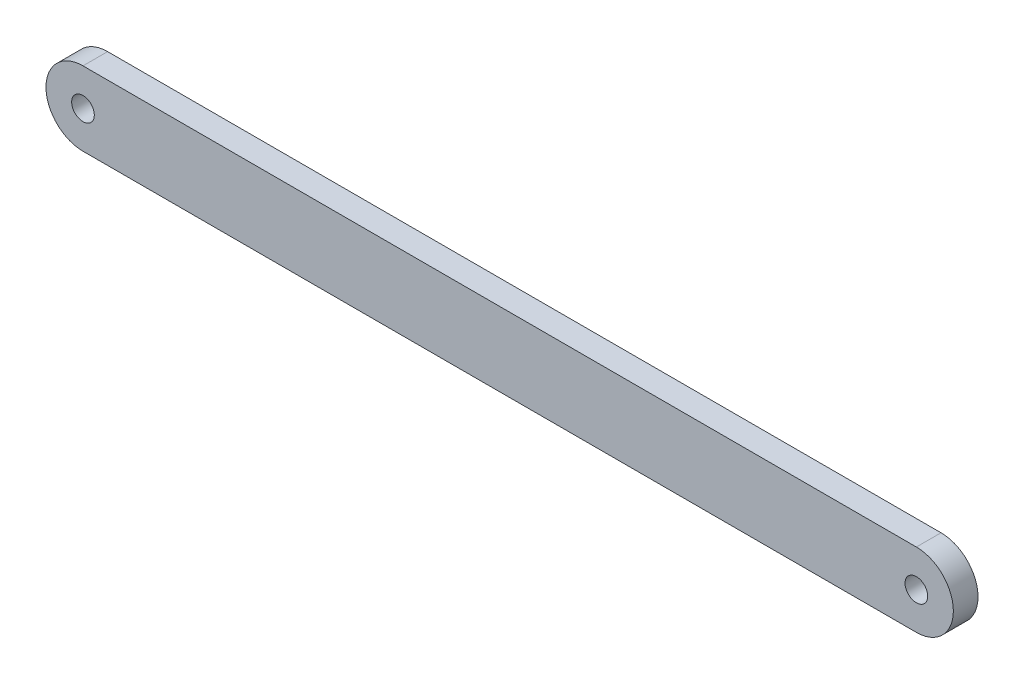
ISO-10303-21;
HEADER;
FILE_DESCRIPTION(('STEP AP214'),'2;1');
FILE_NAME('part.step','',(''),(''),'','','');
FILE_SCHEMA(('AUTOMOTIVE_DESIGN { 1 0 10303 214 1 1 1 1 }'));
ENDSEC;
DATA;
#1=APPLICATION_CONTEXT('core data for automotive mechanical design processes');
#2=APPLICATION_PROTOCOL_DEFINITION('international standard','automotive_design',2000,#1);
#3=PRODUCT_CONTEXT('',#1,'mechanical');
#4=PRODUCT('Part','Part','',(#3));
#5=PRODUCT_RELATED_PRODUCT_CATEGORY('part','',(#4));
#6=PRODUCT_DEFINITION_FORMATION('','',#4);
#7=PRODUCT_DEFINITION_CONTEXT('part definition',#1,'design');
#8=PRODUCT_DEFINITION('design','',#6,#7);
#9=PRODUCT_DEFINITION_SHAPE('','',#8);
#10=(LENGTH_UNIT() NAMED_UNIT(*) SI_UNIT(.MILLI.,.METRE.));
#11=(NAMED_UNIT(*) PLANE_ANGLE_UNIT() SI_UNIT($,.RADIAN.));
#12=(NAMED_UNIT(*) SI_UNIT($,.STERADIAN.) SOLID_ANGLE_UNIT());
#13=UNCERTAINTY_MEASURE_WITH_UNIT(LENGTH_MEASURE(1.E-05),#10,'distance_accuracy_value','');
#14=(GEOMETRIC_REPRESENTATION_CONTEXT(3) GLOBAL_UNCERTAINTY_ASSIGNED_CONTEXT((#13)) GLOBAL_UNIT_ASSIGNED_CONTEXT((#10,
#11,#12)) REPRESENTATION_CONTEXT('',''));
#15=CARTESIAN_POINT('',(0.,0.,0.));
#16=DIRECTION('',(0.,0.,1.));
#17=DIRECTION('',(1.,0.,0.));
#18=AXIS2_PLACEMENT_3D('',#15,#16,#17);
#19=CARTESIAN_POINT('',(84.5233695494921,0.,5.));
#20=DIRECTION('',(0.,0.,-1.));
#21=DIRECTION('',(-1.,0.,0.));
#22=AXIS2_PLACEMENT_3D('',#19,#20,#21);
#23=PLANE('',#22);
#24=CARTESIAN_POINT('',(84.5233695494921,0.,5.));
#25=DIRECTION('',(0.,0.,1.));
#26=DIRECTION('',(-1.,0.,0.));
#27=AXIS2_PLACEMENT_3D('',#24,#25,#26);
#28=CIRCLE('',#27,7.5);
#29=CARTESIAN_POINT('',(84.5233695494921,-7.5,5.));
#30=VERTEX_POINT('',#29);
#31=CARTESIAN_POINT('',(84.5233695494921,7.5,5.));
#32=VERTEX_POINT('',#31);
#33=EDGE_CURVE('E87',#30,#32,#28,.T.);
#34=ORIENTED_EDGE('',*,*,#33,.T.);
#35=DIRECTION('',(-1.,0.,0.));
#36=VECTOR('',#35,1.);
#37=CARTESIAN_POINT('',(-84.5233695494921,7.5,5.));
#38=LINE('',#37,#36);
#39=CARTESIAN_POINT('',(-84.5233695494921,7.5,5.));
#40=VERTEX_POINT('',#39);
#41=EDGE_CURVE('E82',#32,#40,#38,.T.);
#42=ORIENTED_EDGE('',*,*,#41,.T.);
#43=CARTESIAN_POINT('',(-84.5233695494921,0.,5.));
#44=DIRECTION('',(0.,0.,1.));
#45=DIRECTION('',(1.,0.,0.));
#46=AXIS2_PLACEMENT_3D('',#43,#44,#45);
#47=CIRCLE('',#46,7.5);
#48=CARTESIAN_POINT('',(-84.5233695494921,-7.5,5.));
#49=VERTEX_POINT('',#48);
#50=EDGE_CURVE('E85',#40,#49,#47,.T.);
#51=ORIENTED_EDGE('',*,*,#50,.T.);
#52=DIRECTION('',(1.,0.,0.));
#53=VECTOR('',#52,1.);
#54=CARTESIAN_POINT('',(-84.5233695494921,-7.5,5.));
#55=LINE('',#54,#53);
#56=EDGE_CURVE('E52',#49,#30,#55,.T.);
#57=ORIENTED_EDGE('',*,*,#56,.T.);
#58=EDGE_LOOP('',(#34,#42,#51,#57));
#59=FACE_BOUND('',#58,.T.);
#60=CARTESIAN_POINT('',(-84.5233695494921,0.,5.));
#61=DIRECTION('',(0.,0.,1.));
#62=DIRECTION('',(1.,0.,0.));
#63=AXIS2_PLACEMENT_3D('',#60,#61,#62);
#64=CIRCLE('',#63,2.30000000000001);
#65=CARTESIAN_POINT('',(-82.223369549492,0.,5.));
#66=VERTEX_POINT('',#65);
#67=EDGE_CURVE('E102',#66,#66,#64,.T.);
#68=ORIENTED_EDGE('',*,*,#67,.F.);
#69=EDGE_LOOP('',(#68));
#70=FACE_BOUND('',#69,.T.);
#71=CARTESIAN_POINT('',(84.5233695494921,0.,5.));
#72=DIRECTION('',(0.,0.,1.));
#73=DIRECTION('',(1.,0.,0.));
#74=AXIS2_PLACEMENT_3D('',#71,#72,#73);
#75=CIRCLE('',#74,2.30000000000001);
#76=CARTESIAN_POINT('',(86.8233695494921,0.,5.));
#77=VERTEX_POINT('',#76);
#78=EDGE_CURVE('E117',#77,#77,#75,.T.);
#79=ORIENTED_EDGE('',*,*,#78,.F.);
#80=EDGE_LOOP('',(#79));
#81=FACE_BOUND('',#80,.T.);
#82=ADVANCED_FACE('F35',(#59,#70,#81),#23,.F.);
#83=CARTESIAN_POINT('',(84.5233695494921,0.,0.));
#84=DIRECTION('',(0.,0.,-1.));
#85=DIRECTION('',(-1.,0.,0.));
#86=AXIS2_PLACEMENT_3D('',#83,#84,#85);
#87=PLANE('',#86);
#88=CARTESIAN_POINT('',(-84.5233695494921,0.,0.));
#89=DIRECTION('',(0.,0.,1.));
#90=DIRECTION('',(1.,0.,0.));
#91=AXIS2_PLACEMENT_3D('',#88,#89,#90);
#92=CIRCLE('',#91,2.30000000000001);
#93=CARTESIAN_POINT('',(-82.223369549492,0.,0.));
#94=VERTEX_POINT('',#93);
#95=EDGE_CURVE('E114',#94,#94,#92,.T.);
#96=ORIENTED_EDGE('',*,*,#95,.T.);
#97=EDGE_LOOP('',(#96));
#98=FACE_BOUND('',#97,.T.);
#99=CARTESIAN_POINT('',(84.5233695494921,0.,0.));
#100=DIRECTION('',(0.,0.,1.));
#101=DIRECTION('',(-1.,0.,0.));
#102=AXIS2_PLACEMENT_3D('',#99,#100,#101);
#103=CIRCLE('',#102,7.5);
#104=CARTESIAN_POINT('',(84.5233695494921,-7.5,0.));
#105=VERTEX_POINT('',#104);
#106=CARTESIAN_POINT('',(84.5233695494921,7.5,0.));
#107=VERTEX_POINT('',#106);
#108=EDGE_CURVE('E99',#105,#107,#103,.T.);
#109=ORIENTED_EDGE('',*,*,#108,.F.);
#110=DIRECTION('',(1.,0.,0.));
#111=VECTOR('',#110,1.);
#112=CARTESIAN_POINT('',(-84.5233695494921,-7.5,0.));
#113=LINE('',#112,#111);
#114=CARTESIAN_POINT('',(-84.5233695494921,-7.5,0.));
#115=VERTEX_POINT('',#114);
#116=EDGE_CURVE('E75',#115,#105,#113,.T.);
#117=ORIENTED_EDGE('',*,*,#116,.F.);
#118=CARTESIAN_POINT('',(-84.5233695494921,0.,0.));
#119=DIRECTION('',(0.,0.,1.));
#120=DIRECTION('',(1.,0.,0.));
#121=AXIS2_PLACEMENT_3D('',#118,#119,#120);
#122=CIRCLE('',#121,7.5);
#123=CARTESIAN_POINT('',(-84.5233695494921,7.5,0.));
#124=VERTEX_POINT('',#123);
#125=EDGE_CURVE('E69',#124,#115,#122,.T.);
#126=ORIENTED_EDGE('',*,*,#125,.F.);
#127=DIRECTION('',(-1.,0.,0.));
#128=VECTOR('',#127,1.);
#129=CARTESIAN_POINT('',(-84.5233695494921,7.5,0.));
#130=LINE('',#129,#128);
#131=EDGE_CURVE('E91',#107,#124,#130,.T.);
#132=ORIENTED_EDGE('',*,*,#131,.F.);
#133=EDGE_LOOP('',(#109,#117,#126,#132));
#134=FACE_BOUND('',#133,.T.);
#135=CARTESIAN_POINT('',(84.5233695494921,0.,0.));
#136=DIRECTION('',(0.,0.,1.));
#137=DIRECTION('',(1.,0.,0.));
#138=AXIS2_PLACEMENT_3D('',#135,#136,#137);
#139=CIRCLE('',#138,2.30000000000001);
#140=CARTESIAN_POINT('',(86.8233695494921,0.,0.));
#141=VERTEX_POINT('',#140);
#142=EDGE_CURVE('E120',#141,#141,#139,.T.);
#143=ORIENTED_EDGE('',*,*,#142,.T.);
#144=EDGE_LOOP('',(#143));
#145=FACE_BOUND('',#144,.T.);
#146=ADVANCED_FACE('F110',(#98,#134,#145),#87,.T.);
#147=CARTESIAN_POINT('',(84.5233695494921,0.,5.));
#148=DIRECTION('',(0.,0.,-1.));
#149=DIRECTION('',(-1.,0.,0.));
#150=AXIS2_PLACEMENT_3D('',#147,#148,#149);
#151=CYLINDRICAL_SURFACE('',#150,7.5);
#152=ORIENTED_EDGE('',*,*,#108,.T.);
#153=DIRECTION('',(0.,0.,-1.));
#154=VECTOR('',#153,1.);
#155=CARTESIAN_POINT('',(84.5233695494921,7.5,5.));
#156=LINE('',#155,#154);
#157=EDGE_CURVE('E11',#32,#107,#156,.T.);
#158=ORIENTED_EDGE('',*,*,#157,.F.);
#159=ORIENTED_EDGE('',*,*,#33,.F.);
#160=DIRECTION('',(0.,0.,-1.));
#161=VECTOR('',#160,1.);
#162=CARTESIAN_POINT('',(84.5233695494921,-7.5,5.));
#163=LINE('',#162,#161);
#164=EDGE_CURVE('E95',#30,#105,#163,.T.);
#165=ORIENTED_EDGE('',*,*,#164,.T.);
#166=EDGE_LOOP('',(#152,#158,#159,#165));
#167=FACE_BOUND('',#166,.T.);
#168=ADVANCED_FACE('F37',(#167),#151,.T.);
#169=CARTESIAN_POINT('',(-84.5233695494921,7.5,5.));
#170=DIRECTION('',(0.,-1.,0.));
#171=DIRECTION('',(0.,0.,-1.));
#172=AXIS2_PLACEMENT_3D('',#169,#170,#171);
#173=PLANE('',#172);
#174=ORIENTED_EDGE('',*,*,#131,.T.);
#175=DIRECTION('',(0.,0.,-1.));
#176=VECTOR('',#175,1.);
#177=CARTESIAN_POINT('',(-84.5233695494921,7.5,5.));
#178=LINE('',#177,#176);
#179=EDGE_CURVE('E44',#40,#124,#178,.T.);
#180=ORIENTED_EDGE('',*,*,#179,.F.);
#181=ORIENTED_EDGE('',*,*,#41,.F.);
#182=ORIENTED_EDGE('',*,*,#157,.T.);
#183=EDGE_LOOP('',(#174,#180,#181,#182));
#184=FACE_BOUND('',#183,.T.);
#185=ADVANCED_FACE('F90',(#184),#173,.F.);
#186=CARTESIAN_POINT('',(-84.5233695494921,0.,5.));
#187=DIRECTION('',(0.,0.,-1.));
#188=DIRECTION('',(-1.,0.,0.));
#189=AXIS2_PLACEMENT_3D('',#186,#187,#188);
#190=CYLINDRICAL_SURFACE('',#189,7.5);
#191=ORIENTED_EDGE('',*,*,#125,.T.);
#192=DIRECTION('',(0.,0.,-1.));
#193=VECTOR('',#192,1.);
#194=CARTESIAN_POINT('',(-84.5233695494921,-7.5,5.));
#195=LINE('',#194,#193);
#196=EDGE_CURVE('E92',#49,#115,#195,.T.);
#197=ORIENTED_EDGE('',*,*,#196,.F.);
#198=ORIENTED_EDGE('',*,*,#50,.F.);
#199=ORIENTED_EDGE('',*,*,#179,.T.);
#200=EDGE_LOOP('',(#191,#197,#198,#199));
#201=FACE_BOUND('',#200,.T.);
#202=ADVANCED_FACE('F93',(#201),#190,.T.);
#203=CARTESIAN_POINT('',(-84.5233695494921,-7.5,5.));
#204=DIRECTION('',(0.,1.,0.));
#205=DIRECTION('',(0.,0.,1.));
#206=AXIS2_PLACEMENT_3D('',#203,#204,#205);
#207=PLANE('',#206);
#208=ORIENTED_EDGE('',*,*,#116,.T.);
#209=ORIENTED_EDGE('',*,*,#164,.F.);
#210=ORIENTED_EDGE('',*,*,#56,.F.);
#211=ORIENTED_EDGE('',*,*,#196,.T.);
#212=EDGE_LOOP('',(#208,#209,#210,#211));
#213=FACE_BOUND('',#212,.T.);
#214=ADVANCED_FACE('F107',(#213),#207,.F.);
#215=CARTESIAN_POINT('',(-84.5233695494921,0.,5.));
#216=DIRECTION('',(0.,0.,-1.));
#217=DIRECTION('',(-1.,0.,0.));
#218=AXIS2_PLACEMENT_3D('',#215,#216,#217);
#219=CYLINDRICAL_SURFACE('',#218,2.30000000000001);
#220=ORIENTED_EDGE('',*,*,#67,.T.);
#221=EDGE_LOOP('',(#220));
#222=FACE_BOUND('',#221,.T.);
#223=ORIENTED_EDGE('',*,*,#95,.F.);
#224=EDGE_LOOP('',(#223));
#225=FACE_BOUND('',#224,.T.);
#226=ADVANCED_FACE('F137',(#222,#225),#219,.F.);
#227=CARTESIAN_POINT('',(84.5233695494921,0.,5.));
#228=DIRECTION('',(0.,0.,-1.));
#229=DIRECTION('',(-1.,0.,0.));
#230=AXIS2_PLACEMENT_3D('',#227,#228,#229);
#231=CYLINDRICAL_SURFACE('',#230,2.30000000000001);
#232=ORIENTED_EDGE('',*,*,#78,.T.);
#233=EDGE_LOOP('',(#232));
#234=FACE_BOUND('',#233,.T.);
#235=ORIENTED_EDGE('',*,*,#142,.F.);
#236=EDGE_LOOP('',(#235));
#237=FACE_BOUND('',#236,.T.);
#238=ADVANCED_FACE('F126',(#234,#237),#231,.F.);
#239=CLOSED_SHELL('',(#82,#146,#168,#185,#202,#214,#226,#238));
#240=MANIFOLD_SOLID_BREP('B2',#239);
#241=ADVANCED_BREP_SHAPE_REPRESENTATION('',(#18,#240),#14);
#242=SHAPE_DEFINITION_REPRESENTATION(#9,#241);
ENDSEC;
END-ISO-10303-21;
